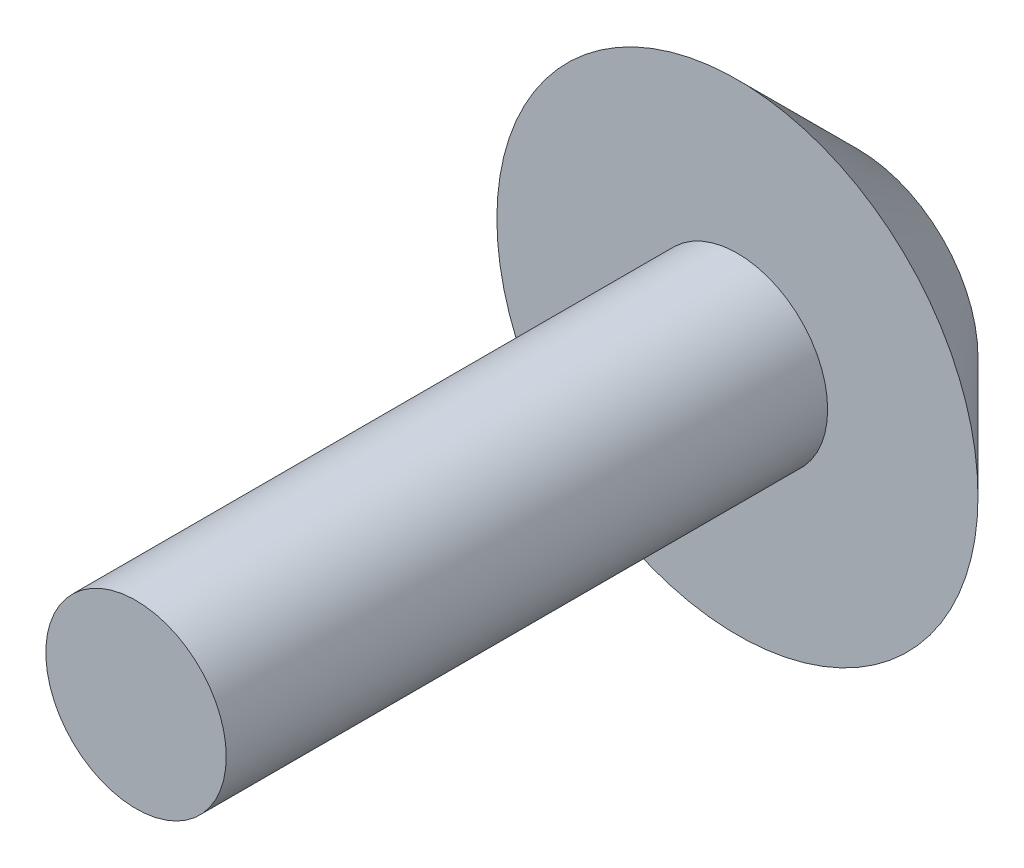
ISO-10303-21;
HEADER;
FILE_DESCRIPTION(('STEP AP214'),'2;1');
FILE_NAME('part.step','',(''),(''),'','','');
FILE_SCHEMA(('AUTOMOTIVE_DESIGN { 1 0 10303 214 1 1 1 1 }'));
ENDSEC;
DATA;
#1=APPLICATION_CONTEXT('core data for automotive mechanical design processes');
#2=APPLICATION_PROTOCOL_DEFINITION('international standard','automotive_design',2000,#1);
#3=PRODUCT_CONTEXT('',#1,'mechanical');
#4=PRODUCT('Part','Part','',(#3));
#5=PRODUCT_RELATED_PRODUCT_CATEGORY('part','',(#4));
#6=PRODUCT_DEFINITION_FORMATION('','',#4);
#7=PRODUCT_DEFINITION_CONTEXT('part definition',#1,'design');
#8=PRODUCT_DEFINITION('design','',#6,#7);
#9=PRODUCT_DEFINITION_SHAPE('','',#8);
#10=(LENGTH_UNIT() NAMED_UNIT(*) SI_UNIT(.MILLI.,.METRE.));
#11=(NAMED_UNIT(*) PLANE_ANGLE_UNIT() SI_UNIT($,.RADIAN.));
#12=(NAMED_UNIT(*) SI_UNIT($,.STERADIAN.) SOLID_ANGLE_UNIT());
#13=UNCERTAINTY_MEASURE_WITH_UNIT(LENGTH_MEASURE(1.E-05),#10,'distance_accuracy_value','');
#14=(GEOMETRIC_REPRESENTATION_CONTEXT(3) GLOBAL_UNCERTAINTY_ASSIGNED_CONTEXT((#13)) GLOBAL_UNIT_ASSIGNED_CONTEXT((#10,
#11,#12)) REPRESENTATION_CONTEXT('',''));
#15=CARTESIAN_POINT('',(0.,0.,0.));
#16=DIRECTION('',(0.,0.,1.));
#17=DIRECTION('',(1.,0.,0.));
#18=AXIS2_PLACEMENT_3D('',#15,#16,#17);
#19=CARTESIAN_POINT('',(0.,0.,10.));
#20=DIRECTION('',(0.,0.,-1.));
#21=DIRECTION('',(-1.,0.,0.));
#22=AXIS2_PLACEMENT_3D('',#19,#20,#21);
#23=CYLINDRICAL_SURFACE('',#22,1.5);
#24=CARTESIAN_POINT('',(0.,0.,0.));
#25=DIRECTION('',(0.,0.,1.));
#26=DIRECTION('',(1.,0.,0.));
#27=AXIS2_PLACEMENT_3D('',#24,#25,#26);
#28=CIRCLE('',#27,1.5);
#29=CARTESIAN_POINT('',(1.5,0.,0.));
#30=VERTEX_POINT('',#29);
#31=EDGE_CURVE('E137',#30,#30,#28,.T.);
#32=ORIENTED_EDGE('',*,*,#31,.T.);
#33=EDGE_LOOP('',(#32));
#34=FACE_BOUND('',#33,.T.);
#35=CARTESIAN_POINT('',(0.,0.,10.));
#36=DIRECTION('',(0.,0.,1.));
#37=DIRECTION('',(1.,0.,0.));
#38=AXIS2_PLACEMENT_3D('',#35,#36,#37);
#39=CIRCLE('',#38,1.5);
#40=CARTESIAN_POINT('',(1.5,0.,10.));
#41=VERTEX_POINT('',#40);
#42=EDGE_CURVE('E43',#41,#41,#39,.T.);
#43=ORIENTED_EDGE('',*,*,#42,.F.);
#44=EDGE_LOOP('',(#43));
#45=FACE_BOUND('',#44,.T.);
#46=ADVANCED_FACE('F34',(#34,#45),#23,.T.);
#47=CARTESIAN_POINT('',(0.,0.,10.));
#48=DIRECTION('',(0.,0.,1.));
#49=DIRECTION('',(1.,0.,0.));
#50=AXIS2_PLACEMENT_3D('',#47,#48,#49);
#51=PLANE('',#50);
#52=ORIENTED_EDGE('',*,*,#42,.T.);
#53=EDGE_LOOP('',(#52));
#54=FACE_BOUND('',#53,.T.);
#55=ADVANCED_FACE('F150',(#54),#51,.T.);
#56=CARTESIAN_POINT('',(0.,0.,0.));
#57=DIRECTION('',(0.,0.,1.));
#58=DIRECTION('',(1.,0.,0.));
#59=AXIS2_PLACEMENT_3D('',#56,#57,#58);
#60=PLANE('',#59);
#61=ORIENTED_EDGE('',*,*,#31,.F.);
#62=EDGE_LOOP('',(#61));
#63=FACE_BOUND('',#62,.T.);
#64=CARTESIAN_POINT('',(0.,0.,0.));
#65=DIRECTION('',(0.,0.,1.));
#66=DIRECTION('',(1.,0.,0.));
#67=AXIS2_PLACEMENT_3D('',#64,#65,#66);
#68=CIRCLE('',#67,4.);
#69=CARTESIAN_POINT('',(4.,0.,0.));
#70=VERTEX_POINT('',#69);
#71=EDGE_CURVE('E145',#70,#70,#68,.T.);
#72=ORIENTED_EDGE('',*,*,#71,.T.);
#73=EDGE_LOOP('',(#72));
#74=FACE_BOUND('',#73,.T.);
#75=ADVANCED_FACE('F157',(#63,#74),#60,.T.);
#76=CARTESIAN_POINT('',(0.,0.,-2.));
#77=DIRECTION('',(0.,0.,-1.));
#78=DIRECTION('',(-1.,0.,0.));
#79=AXIS2_PLACEMENT_3D('',#76,#77,#78);
#80=PLANE('',#79);
#81=CARTESIAN_POINT('',(0.,0.,-2.));
#82=DIRECTION('',(0.,0.,-1.));
#83=DIRECTION('',(-1.,0.,0.));
#84=AXIS2_PLACEMENT_3D('',#81,#82,#83);
#85=CIRCLE('',#84,1.99999999999999);
#86=CARTESIAN_POINT('',(-1.99999999999999,0.,-2.));
#87=VERTEX_POINT('',#86);
#88=EDGE_CURVE('E11',#87,#87,#85,.T.);
#89=ORIENTED_EDGE('',*,*,#88,.T.);
#90=EDGE_LOOP('',(#89));
#91=FACE_BOUND('',#90,.T.);
#92=DIRECTION('',(0.866025403784441,0.499999999999995,0.));
#93=VECTOR('',#92,1.);
#94=CARTESIAN_POINT('',(-1.68618330299495,0.973518383887213,-2.));
#95=LINE('',#94,#93);
#96=CARTESIAN_POINT('',(-1.68618330299495,0.973518383887213,-2.));
#97=VERTEX_POINT('',#96);
#98=CARTESIAN_POINT('',(0.,1.94703676777439,-2.));
#99=VERTEX_POINT('',#98);
#100=EDGE_CURVE('E50',#97,#99,#95,.T.);
#101=ORIENTED_EDGE('',*,*,#100,.F.);
#102=DIRECTION('',(0.,1.,0.));
#103=VECTOR('',#102,1.);
#104=CARTESIAN_POINT('',(-1.68618330299497,-0.973518383887177,-2.));
#105=LINE('',#104,#103);
#106=CARTESIAN_POINT('',(-1.68618330299497,-0.973518383887177,-2.));
#107=VERTEX_POINT('',#106);
#108=EDGE_CURVE('E133',#107,#97,#105,.T.);
#109=ORIENTED_EDGE('',*,*,#108,.F.);
#110=DIRECTION('',(-0.866025403784435,0.500000000000007,0.));
#111=VECTOR('',#110,1.);
#112=CARTESIAN_POINT('',(0.,-1.94703676777439,-2.));
#113=LINE('',#112,#111);
#114=CARTESIAN_POINT('',(0.,-1.94703676777439,-2.));
#115=VERTEX_POINT('',#114);
#116=EDGE_CURVE('E131',#115,#107,#113,.T.);
#117=ORIENTED_EDGE('',*,*,#116,.F.);
#118=DIRECTION('',(-0.866025403784442,-0.499999999999995,0.));
#119=VECTOR('',#118,1.);
#120=CARTESIAN_POINT('',(1.68618330299496,-0.973518383887201,-2.));
#121=LINE('',#120,#119);
#122=CARTESIAN_POINT('',(1.68618330299496,-0.973518383887201,-2.));
#123=VERTEX_POINT('',#122);
#124=EDGE_CURVE('E98',#123,#115,#121,.T.);
#125=ORIENTED_EDGE('',*,*,#124,.F.);
#126=DIRECTION('',(0.,-1.,0.));
#127=VECTOR('',#126,1.);
#128=CARTESIAN_POINT('',(1.68618330299496,0.973518383887189,-2.));
#129=LINE('',#128,#127);
#130=CARTESIAN_POINT('',(1.68618330299496,0.973518383887189,-2.));
#131=VERTEX_POINT('',#130);
#132=EDGE_CURVE('E127',#131,#123,#129,.T.);
#133=ORIENTED_EDGE('',*,*,#132,.F.);
#134=DIRECTION('',(0.866025403784438,-0.500000000000001,0.));
#135=VECTOR('',#134,1.);
#136=CARTESIAN_POINT('',(0.,1.94703676777439,-2.));
#137=LINE('',#136,#135);
#138=EDGE_CURVE('E124',#99,#131,#137,.T.);
#139=ORIENTED_EDGE('',*,*,#138,.F.);
#140=EDGE_LOOP('',(#101,#109,#117,#125,#133,#139));
#141=FACE_BOUND('',#140,.T.);
#142=ADVANCED_FACE('F160',(#91,#141),#80,.T.);
#143=CARTESIAN_POINT('',(-1.68618330299495,0.973518383887213,-0.5));
#144=DIRECTION('',(-0.499999999999995,0.866025403784441,0.));
#145=DIRECTION('',(-0.866025403784441,-0.499999999999995,0.));
#146=AXIS2_PLACEMENT_3D('',#143,#144,#145);
#147=PLANE('',#146);
#148=ORIENTED_EDGE('',*,*,#100,.T.);
#149=DIRECTION('',(0.,0.,-1.));
#150=VECTOR('',#149,1.);
#151=CARTESIAN_POINT('',(0.,1.94703676777439,-0.5));
#152=LINE('',#151,#150);
#153=CARTESIAN_POINT('',(0.,1.94703676777439,-0.5));
#154=VERTEX_POINT('',#153);
#155=EDGE_CURVE('E80',#154,#99,#152,.T.);
#156=ORIENTED_EDGE('',*,*,#155,.F.);
#157=DIRECTION('',(0.866025403784441,0.499999999999995,0.));
#158=VECTOR('',#157,1.);
#159=CARTESIAN_POINT('',(-1.68618330299495,0.973518383887213,-0.5));
#160=LINE('',#159,#158);
#161=CARTESIAN_POINT('',(-1.68618330299495,0.973518383887213,-0.5));
#162=VERTEX_POINT('',#161);
#163=EDGE_CURVE('E135',#162,#154,#160,.T.);
#164=ORIENTED_EDGE('',*,*,#163,.F.);
#165=DIRECTION('',(0.,0.,-1.));
#166=VECTOR('',#165,1.);
#167=CARTESIAN_POINT('',(-1.68618330299495,0.973518383887213,-0.5));
#168=LINE('',#167,#166);
#169=EDGE_CURVE('E58',#162,#97,#168,.T.);
#170=ORIENTED_EDGE('',*,*,#169,.T.);
#171=EDGE_LOOP('',(#148,#156,#164,#170));
#172=FACE_BOUND('',#171,.T.);
#173=ADVANCED_FACE('F163',(#172),#147,.F.);
#174=CARTESIAN_POINT('',(-1.68618330299497,-0.973518383887177,-0.5));
#175=DIRECTION('',(-1.,0.,0.));
#176=DIRECTION('',(0.,-1.,0.));
#177=AXIS2_PLACEMENT_3D('',#174,#175,#176);
#178=PLANE('',#177);
#179=ORIENTED_EDGE('',*,*,#108,.T.);
#180=ORIENTED_EDGE('',*,*,#169,.F.);
#181=DIRECTION('',(0.,1.,0.));
#182=VECTOR('',#181,1.);
#183=CARTESIAN_POINT('',(-1.68618330299497,-0.973518383887177,-0.5));
#184=LINE('',#183,#182);
#185=CARTESIAN_POINT('',(-1.68618330299497,-0.973518383887177,-0.5));
#186=VERTEX_POINT('',#185);
#187=EDGE_CURVE('E110',#186,#162,#184,.T.);
#188=ORIENTED_EDGE('',*,*,#187,.F.);
#189=DIRECTION('',(0.,0.,-1.));
#190=VECTOR('',#189,1.);
#191=CARTESIAN_POINT('',(-1.68618330299497,-0.973518383887177,-0.5));
#192=LINE('',#191,#190);
#193=EDGE_CURVE('E102',#186,#107,#192,.T.);
#194=ORIENTED_EDGE('',*,*,#193,.T.);
#195=EDGE_LOOP('',(#179,#180,#188,#194));
#196=FACE_BOUND('',#195,.T.);
#197=ADVANCED_FACE('F170',(#196),#178,.F.);
#198=CARTESIAN_POINT('',(0.,-1.94703676777439,-0.5));
#199=DIRECTION('',(-0.500000000000007,-0.866025403784434,0.));
#200=DIRECTION('',(0.866025403784435,-0.500000000000007,0.));
#201=AXIS2_PLACEMENT_3D('',#198,#199,#200);
#202=PLANE('',#201);
#203=ORIENTED_EDGE('',*,*,#116,.T.);
#204=ORIENTED_EDGE('',*,*,#193,.F.);
#205=DIRECTION('',(-0.866025403784435,0.500000000000007,0.));
#206=VECTOR('',#205,1.);
#207=CARTESIAN_POINT('',(0.,-1.94703676777439,-0.5));
#208=LINE('',#207,#206);
#209=CARTESIAN_POINT('',(0.,-1.94703676777439,-0.5));
#210=VERTEX_POINT('',#209);
#211=EDGE_CURVE('E106',#210,#186,#208,.T.);
#212=ORIENTED_EDGE('',*,*,#211,.F.);
#213=DIRECTION('',(0.,0.,-1.));
#214=VECTOR('',#213,1.);
#215=CARTESIAN_POINT('',(0.,-1.94703676777439,-0.5));
#216=LINE('',#215,#214);
#217=EDGE_CURVE('E91',#210,#115,#216,.T.);
#218=ORIENTED_EDGE('',*,*,#217,.T.);
#219=EDGE_LOOP('',(#203,#204,#212,#218));
#220=FACE_BOUND('',#219,.T.);
#221=ADVANCED_FACE('F107',(#220),#202,.F.);
#222=CARTESIAN_POINT('',(1.68618330299496,-0.973518383887201,-0.5));
#223=DIRECTION('',(0.499999999999995,-0.866025403784441,0.));
#224=DIRECTION('',(0.866025403784442,0.499999999999995,0.));
#225=AXIS2_PLACEMENT_3D('',#222,#223,#224);
#226=PLANE('',#225);
#227=ORIENTED_EDGE('',*,*,#124,.T.);
#228=ORIENTED_EDGE('',*,*,#217,.F.);
#229=DIRECTION('',(-0.866025403784442,-0.499999999999995,0.));
#230=VECTOR('',#229,1.);
#231=CARTESIAN_POINT('',(1.68618330299496,-0.973518383887201,-0.5));
#232=LINE('',#231,#230);
#233=CARTESIAN_POINT('',(1.68618330299496,-0.973518383887201,-0.5));
#234=VERTEX_POINT('',#233);
#235=EDGE_CURVE('E95',#234,#210,#232,.T.);
#236=ORIENTED_EDGE('',*,*,#235,.F.);
#237=DIRECTION('',(0.,0.,-1.));
#238=VECTOR('',#237,1.);
#239=CARTESIAN_POINT('',(1.68618330299496,-0.973518383887201,-0.5));
#240=LINE('',#239,#238);
#241=EDGE_CURVE('E103',#234,#123,#240,.T.);
#242=ORIENTED_EDGE('',*,*,#241,.T.);
#243=EDGE_LOOP('',(#227,#228,#236,#242));
#244=FACE_BOUND('',#243,.T.);
#245=ADVANCED_FACE('F93',(#244),#226,.F.);
#246=CARTESIAN_POINT('',(1.68618330299496,0.973518383887189,-0.5));
#247=DIRECTION('',(1.,0.,0.));
#248=DIRECTION('',(0.,1.,0.));
#249=AXIS2_PLACEMENT_3D('',#246,#247,#248);
#250=PLANE('',#249);
#251=ORIENTED_EDGE('',*,*,#132,.T.);
#252=ORIENTED_EDGE('',*,*,#241,.F.);
#253=DIRECTION('',(0.,-1.,0.));
#254=VECTOR('',#253,1.);
#255=CARTESIAN_POINT('',(1.68618330299496,0.973518383887189,-0.5));
#256=LINE('',#255,#254);
#257=CARTESIAN_POINT('',(1.68618330299496,0.973518383887189,-0.5));
#258=VERTEX_POINT('',#257);
#259=EDGE_CURVE('E116',#258,#234,#256,.T.);
#260=ORIENTED_EDGE('',*,*,#259,.F.);
#261=DIRECTION('',(0.,0.,-1.));
#262=VECTOR('',#261,1.);
#263=CARTESIAN_POINT('',(1.68618330299496,0.973518383887189,-0.5));
#264=LINE('',#263,#262);
#265=EDGE_CURVE('E140',#258,#131,#264,.T.);
#266=ORIENTED_EDGE('',*,*,#265,.T.);
#267=EDGE_LOOP('',(#251,#252,#260,#266));
#268=FACE_BOUND('',#267,.T.);
#269=ADVANCED_FACE('F174',(#268),#250,.F.);
#270=CARTESIAN_POINT('',(0.,1.94703676777439,-0.5));
#271=DIRECTION('',(0.500000000000001,0.866025403784438,0.));
#272=DIRECTION('',(-0.866025403784438,0.500000000000001,0.));
#273=AXIS2_PLACEMENT_3D('',#270,#271,#272);
#274=PLANE('',#273);
#275=ORIENTED_EDGE('',*,*,#138,.T.);
#276=ORIENTED_EDGE('',*,*,#265,.F.);
#277=DIRECTION('',(0.866025403784438,-0.500000000000001,0.));
#278=VECTOR('',#277,1.);
#279=CARTESIAN_POINT('',(0.,1.94703676777439,-0.5));
#280=LINE('',#279,#278);
#281=EDGE_CURVE('E118',#154,#258,#280,.T.);
#282=ORIENTED_EDGE('',*,*,#281,.F.);
#283=ORIENTED_EDGE('',*,*,#155,.T.);
#284=EDGE_LOOP('',(#275,#276,#282,#283));
#285=FACE_BOUND('',#284,.T.);
#286=ADVANCED_FACE('F171',(#285),#274,.F.);
#287=CARTESIAN_POINT('',(0.,0.,-0.5));
#288=DIRECTION('',(0.,0.,-1.));
#289=DIRECTION('',(-1.,0.,0.));
#290=AXIS2_PLACEMENT_3D('',#287,#288,#289);
#291=PLANE('',#290);
#292=ORIENTED_EDGE('',*,*,#163,.T.);
#293=ORIENTED_EDGE('',*,*,#281,.T.);
#294=ORIENTED_EDGE('',*,*,#259,.T.);
#295=ORIENTED_EDGE('',*,*,#235,.T.);
#296=ORIENTED_EDGE('',*,*,#211,.T.);
#297=ORIENTED_EDGE('',*,*,#187,.T.);
#298=EDGE_LOOP('',(#292,#293,#294,#295,#296,#297));
#299=FACE_BOUND('',#298,.T.);
#300=ADVANCED_FACE('F113',(#299),#291,.T.);
#301=CARTESIAN_POINT('',(0.,0.,0.));
#302=DIRECTION('',(0.,0.,1.));
#303=DIRECTION('',(1.,0.,0.));
#304=AXIS2_PLACEMENT_3D('',#301,#302,#303);
#305=CONICAL_SURFACE('',#304,4.,0.78539816339745);
#306=ORIENTED_EDGE('',*,*,#88,.F.);
#307=EDGE_LOOP('',(#306));
#308=FACE_BOUND('',#307,.T.);
#309=ORIENTED_EDGE('',*,*,#71,.F.);
#310=EDGE_LOOP('',(#309));
#311=FACE_BOUND('',#310,.T.);
#312=ADVANCED_FACE('F37',(#308,#311),#305,.T.);
#313=CLOSED_SHELL('',(#46,#55,#75,#142,#173,#197,#221,#245,#269,#286,#300,#312));
#314=MANIFOLD_SOLID_BREP('B2',#313);
#315=ADVANCED_BREP_SHAPE_REPRESENTATION('',(#18,#314),#14);
#316=SHAPE_DEFINITION_REPRESENTATION(#9,#315);
ENDSEC;
END-ISO-10303-21;
